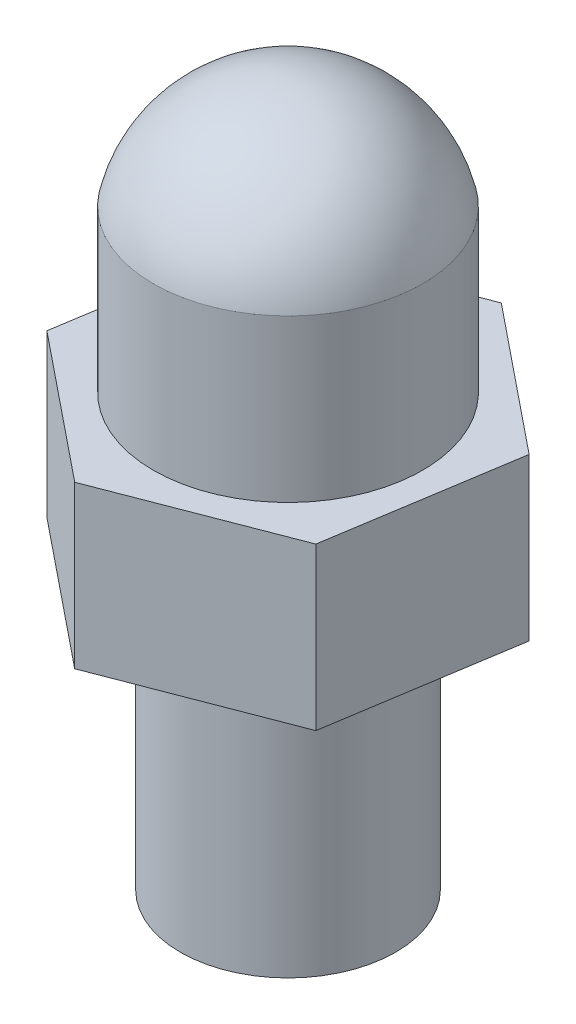
ISO-10303-21;
HEADER;
FILE_DESCRIPTION(('STEP AP214'),'2;1');
FILE_NAME('part.step','',(''),(''),'','','');
FILE_SCHEMA(('AUTOMOTIVE_DESIGN { 1 0 10303 214 1 1 1 1 }'));
ENDSEC;
DATA;
#1=APPLICATION_CONTEXT('core data for automotive mechanical design processes');
#2=APPLICATION_PROTOCOL_DEFINITION('international standard','automotive_design',2000,#1);
#3=PRODUCT_CONTEXT('',#1,'mechanical');
#4=PRODUCT('Part','Part','',(#3));
#5=PRODUCT_RELATED_PRODUCT_CATEGORY('part','',(#4));
#6=PRODUCT_DEFINITION_FORMATION('','',#4);
#7=PRODUCT_DEFINITION_CONTEXT('part definition',#1,'design');
#8=PRODUCT_DEFINITION('design','',#6,#7);
#9=PRODUCT_DEFINITION_SHAPE('','',#8);
#10=(LENGTH_UNIT() NAMED_UNIT(*) SI_UNIT(.MILLI.,.METRE.));
#11=(NAMED_UNIT(*) PLANE_ANGLE_UNIT() SI_UNIT($,.RADIAN.));
#12=(NAMED_UNIT(*) SI_UNIT($,.STERADIAN.) SOLID_ANGLE_UNIT());
#13=UNCERTAINTY_MEASURE_WITH_UNIT(LENGTH_MEASURE(1.E-05),#10,'distance_accuracy_value','');
#14=(GEOMETRIC_REPRESENTATION_CONTEXT(3) GLOBAL_UNCERTAINTY_ASSIGNED_CONTEXT((#13)) GLOBAL_UNIT_ASSIGNED_CONTEXT((#10,
#11,#12)) REPRESENTATION_CONTEXT('',''));
#15=CARTESIAN_POINT('',(0.,0.,0.));
#16=DIRECTION('',(0.,0.,1.));
#17=DIRECTION('',(1.,0.,0.));
#18=AXIS2_PLACEMENT_3D('',#15,#16,#17);
#19=CARTESIAN_POINT('',(0.,5.,0.));
#20=DIRECTION('',(0.,-1.,0.));
#21=DIRECTION('',(0.,0.,-1.));
#22=AXIS2_PLACEMENT_3D('',#19,#20,#21);
#23=CYLINDRICAL_SURFACE('',#22,2.);
#24=CARTESIAN_POINT('',(0.,5.,0.));
#25=DIRECTION('',(0.,1.,0.));
#26=DIRECTION('',(0.,0.,1.));
#27=AXIS2_PLACEMENT_3D('',#24,#25,#26);
#28=CIRCLE('',#27,2.);
#29=CARTESIAN_POINT('',(0.,5.,2.));
#30=VERTEX_POINT('',#29);
#31=EDGE_CURVE('E11',#30,#30,#28,.T.);
#32=ORIENTED_EDGE('',*,*,#31,.F.);
#33=EDGE_LOOP('',(#32));
#34=FACE_BOUND('',#33,.T.);
#35=CARTESIAN_POINT('',(0.,0.,0.));
#36=DIRECTION('',(0.,1.,0.));
#37=DIRECTION('',(0.,0.,1.));
#38=AXIS2_PLACEMENT_3D('',#35,#36,#37);
#39=CIRCLE('',#38,2.);
#40=CARTESIAN_POINT('',(0.,0.,2.));
#41=VERTEX_POINT('',#40);
#42=EDGE_CURVE('E42',#41,#41,#39,.T.);
#43=ORIENTED_EDGE('',*,*,#42,.T.);
#44=EDGE_LOOP('',(#43));
#45=FACE_BOUND('',#44,.T.);
#46=ADVANCED_FACE('F32',(#34,#45),#23,.T.);
#47=CARTESIAN_POINT('',(0.,0.,0.));
#48=DIRECTION('',(0.,1.,0.));
#49=DIRECTION('',(0.,0.,1.));
#50=AXIS2_PLACEMENT_3D('',#47,#48,#49);
#51=PLANE('',#50);
#52=ORIENTED_EDGE('',*,*,#42,.F.);
#53=EDGE_LOOP('',(#52));
#54=FACE_BOUND('',#53,.T.);
#55=ADVANCED_FACE('F142',(#54),#51,.F.);
#56=CARTESIAN_POINT('',(-0.538668538753638,8.,3.42196379369464));
#57=DIRECTION('',(-0.359250794673279,0.,-0.933241054887009));
#58=DIRECTION('',(-0.933241054887009,0.,0.359250794673279));
#59=AXIS2_PLACEMENT_3D('',#56,#57,#58);
#60=PLANE('',#59);
#61=DIRECTION('',(0.933241054887009,0.,-0.359250794673279));
#62=VECTOR('',#61,1.);
#63=CARTESIAN_POINT('',(-0.538668538753638,5.,3.42196379369464));
#64=LINE('',#63,#62);
#65=CARTESIAN_POINT('',(-0.538668538753638,5.,3.42196379369464));
#66=VERTEX_POINT('',#65);
#67=CARTESIAN_POINT('',(2.69417330679331,5.,2.17748253562741));
#68=VERTEX_POINT('',#67);
#69=EDGE_CURVE('E120',#66,#68,#64,.T.);
#70=ORIENTED_EDGE('',*,*,#69,.T.);
#71=DIRECTION('',(0.,-1.,0.));
#72=VECTOR('',#71,1.);
#73=CARTESIAN_POINT('',(2.69417330679331,8.,2.17748253562741));
#74=LINE('',#73,#72);
#75=CARTESIAN_POINT('',(2.69417330679331,8.,2.17748253562741));
#76=VERTEX_POINT('',#75);
#77=EDGE_CURVE('E137',#76,#68,#74,.T.);
#78=ORIENTED_EDGE('',*,*,#77,.F.);
#79=DIRECTION('',(0.933241054887009,0.,-0.359250794673279));
#80=VECTOR('',#79,1.);
#81=CARTESIAN_POINT('',(-0.538668538753638,8.,3.42196379369464));
#82=LINE('',#81,#80);
#83=CARTESIAN_POINT('',(-0.538668538753638,8.,3.42196379369464));
#84=VERTEX_POINT('',#83);
#85=EDGE_CURVE('E130',#84,#76,#82,.T.);
#86=ORIENTED_EDGE('',*,*,#85,.F.);
#87=DIRECTION('',(0.,-1.,0.));
#88=VECTOR('',#87,1.);
#89=CARTESIAN_POINT('',(-0.538668538753638,8.,3.42196379369464));
#90=LINE('',#89,#88);
#91=EDGE_CURVE('E116',#84,#66,#90,.T.);
#92=ORIENTED_EDGE('',*,*,#91,.T.);
#93=EDGE_LOOP('',(#70,#78,#86,#92));
#94=FACE_BOUND('',#93,.T.);
#95=ADVANCED_FACE('F144',(#94),#60,.F.);
#96=CARTESIAN_POINT('',(2.69417330679331,8.,2.17748253562741));
#97=DIRECTION('',(-0.987835858723377,0.,-0.155500212926698));
#98=DIRECTION('',(-0.155500212926698,0.,0.987835858723377));
#99=AXIS2_PLACEMENT_3D('',#96,#97,#98);
#100=PLANE('',#99);
#101=DIRECTION('',(0.155500212926698,0.,-0.987835858723377));
#102=VECTOR('',#101,1.);
#103=CARTESIAN_POINT('',(2.69417330679331,5.,2.17748253562741));
#104=LINE('',#103,#102);
#105=CARTESIAN_POINT('',(3.23284184554695,5.,-1.24448125806723));
#106=VERTEX_POINT('',#105);
#107=EDGE_CURVE('E123',#68,#106,#104,.T.);
#108=ORIENTED_EDGE('',*,*,#107,.T.);
#109=DIRECTION('',(0.,-1.,0.));
#110=VECTOR('',#109,1.);
#111=CARTESIAN_POINT('',(3.23284184554695,8.,-1.24448125806723));
#112=LINE('',#111,#110);
#113=CARTESIAN_POINT('',(3.23284184554695,8.,-1.24448125806723));
#114=VERTEX_POINT('',#113);
#115=EDGE_CURVE('E134',#114,#106,#112,.T.);
#116=ORIENTED_EDGE('',*,*,#115,.F.);
#117=DIRECTION('',(0.155500212926698,0.,-0.987835858723377));
#118=VECTOR('',#117,1.);
#119=CARTESIAN_POINT('',(2.69417330679331,8.,2.17748253562741));
#120=LINE('',#119,#118);
#121=EDGE_CURVE('E89',#76,#114,#120,.T.);
#122=ORIENTED_EDGE('',*,*,#121,.F.);
#123=ORIENTED_EDGE('',*,*,#77,.T.);
#124=EDGE_LOOP('',(#108,#116,#122,#123));
#125=FACE_BOUND('',#124,.T.);
#126=ADVANCED_FACE('F150',(#125),#100,.F.);
#127=CARTESIAN_POINT('',(3.23284184554695,8.,-1.24448125806723));
#128=DIRECTION('',(-0.628585064050098,0.,0.777740841960311));
#129=DIRECTION('',(0.777740841960312,0.,0.628585064050098));
#130=AXIS2_PLACEMENT_3D('',#127,#128,#129);
#131=PLANE('',#130);
#132=DIRECTION('',(-0.777740841960312,0.,-0.628585064050098));
#133=VECTOR('',#132,1.);
#134=CARTESIAN_POINT('',(3.23284184554695,5.,-1.24448125806723));
#135=LINE('',#134,#133);
#136=CARTESIAN_POINT('',(0.538668538753638,5.,-3.42196379369464));
#137=VERTEX_POINT('',#136);
#138=EDGE_CURVE('E125',#106,#137,#135,.T.);
#139=ORIENTED_EDGE('',*,*,#138,.T.);
#140=DIRECTION('',(0.,-1.,0.));
#141=VECTOR('',#140,1.);
#142=CARTESIAN_POINT('',(0.538668538753638,8.,-3.42196379369464));
#143=LINE('',#142,#141);
#144=CARTESIAN_POINT('',(0.538668538753638,8.,-3.42196379369464));
#145=VERTEX_POINT('',#144);
#146=EDGE_CURVE('E111',#145,#137,#143,.T.);
#147=ORIENTED_EDGE('',*,*,#146,.F.);
#148=DIRECTION('',(-0.777740841960312,0.,-0.628585064050098));
#149=VECTOR('',#148,1.);
#150=CARTESIAN_POINT('',(3.23284184554695,8.,-1.24448125806723));
#151=LINE('',#150,#149);
#152=EDGE_CURVE('E102',#114,#145,#151,.T.);
#153=ORIENTED_EDGE('',*,*,#152,.F.);
#154=ORIENTED_EDGE('',*,*,#115,.T.);
#155=EDGE_LOOP('',(#139,#147,#153,#154));
#156=FACE_BOUND('',#155,.T.);
#157=ADVANCED_FACE('F157',(#156),#131,.F.);
#158=CARTESIAN_POINT('',(0.538668538753638,8.,-3.42196379369464));
#159=DIRECTION('',(0.359250794673279,0.,0.933241054887009));
#160=DIRECTION('',(0.933241054887009,0.,-0.359250794673279));
#161=AXIS2_PLACEMENT_3D('',#158,#159,#160);
#162=PLANE('',#161);
#163=DIRECTION('',(-0.933241054887009,0.,0.359250794673279));
#164=VECTOR('',#163,1.);
#165=CARTESIAN_POINT('',(0.538668538753638,5.,-3.42196379369464));
#166=LINE('',#165,#164);
#167=CARTESIAN_POINT('',(-2.69417330679331,5.,-2.17748253562741));
#168=VERTEX_POINT('',#167);
#169=EDGE_CURVE('E110',#137,#168,#166,.T.);
#170=ORIENTED_EDGE('',*,*,#169,.T.);
#171=DIRECTION('',(0.,-1.,0.));
#172=VECTOR('',#171,1.);
#173=CARTESIAN_POINT('',(-2.69417330679331,8.,-2.17748253562741));
#174=LINE('',#173,#172);
#175=CARTESIAN_POINT('',(-2.69417330679331,8.,-2.17748253562741));
#176=VERTEX_POINT('',#175);
#177=EDGE_CURVE('E107',#176,#168,#174,.T.);
#178=ORIENTED_EDGE('',*,*,#177,.F.);
#179=DIRECTION('',(-0.933241054887009,0.,0.359250794673279));
#180=VECTOR('',#179,1.);
#181=CARTESIAN_POINT('',(0.538668538753638,8.,-3.42196379369464));
#182=LINE('',#181,#180);
#183=EDGE_CURVE('E96',#145,#176,#182,.T.);
#184=ORIENTED_EDGE('',*,*,#183,.F.);
#185=ORIENTED_EDGE('',*,*,#146,.T.);
#186=EDGE_LOOP('',(#170,#178,#184,#185));
#187=FACE_BOUND('',#186,.T.);
#188=ADVANCED_FACE('F108',(#187),#162,.F.);
#189=CARTESIAN_POINT('',(-2.69417330679331,8.,-2.17748253562741));
#190=DIRECTION('',(0.987835858723377,0.,0.155500212926698));
#191=DIRECTION('',(0.155500212926698,0.,-0.987835858723377));
#192=AXIS2_PLACEMENT_3D('',#189,#190,#191);
#193=PLANE('',#192);
#194=DIRECTION('',(-0.155500212926698,0.,0.987835858723377));
#195=VECTOR('',#194,1.);
#196=CARTESIAN_POINT('',(-2.69417330679331,5.,-2.17748253562741));
#197=LINE('',#196,#195);
#198=CARTESIAN_POINT('',(-3.23284184554695,5.,1.24448125806723));
#199=VERTEX_POINT('',#198);
#200=EDGE_CURVE('E74',#168,#199,#197,.T.);
#201=ORIENTED_EDGE('',*,*,#200,.T.);
#202=DIRECTION('',(0.,-1.,0.));
#203=VECTOR('',#202,1.);
#204=CARTESIAN_POINT('',(-3.23284184554695,8.,1.24448125806723));
#205=LINE('',#204,#203);
#206=CARTESIAN_POINT('',(-3.23284184554695,8.,1.24448125806723));
#207=VERTEX_POINT('',#206);
#208=EDGE_CURVE('E112',#207,#199,#205,.T.);
#209=ORIENTED_EDGE('',*,*,#208,.F.);
#210=DIRECTION('',(-0.155500212926698,0.,0.987835858723377));
#211=VECTOR('',#210,1.);
#212=CARTESIAN_POINT('',(-2.69417330679331,8.,-2.17748253562741));
#213=LINE('',#212,#211);
#214=EDGE_CURVE('E100',#176,#207,#213,.T.);
#215=ORIENTED_EDGE('',*,*,#214,.F.);
#216=ORIENTED_EDGE('',*,*,#177,.T.);
#217=EDGE_LOOP('',(#201,#209,#215,#216));
#218=FACE_BOUND('',#217,.T.);
#219=ADVANCED_FACE('F114',(#218),#193,.F.);
#220=CARTESIAN_POINT('',(-3.23284184554695,8.,1.24448125806723));
#221=DIRECTION('',(0.628585064050098,0.,-0.777740841960311));
#222=DIRECTION('',(-0.777740841960312,0.,-0.628585064050098));
#223=AXIS2_PLACEMENT_3D('',#220,#221,#222);
#224=PLANE('',#223);
#225=DIRECTION('',(0.777740841960311,0.,0.628585064050098));
#226=VECTOR('',#225,1.);
#227=CARTESIAN_POINT('',(-3.23284184554695,5.,1.24448125806723));
#228=LINE('',#227,#226);
#229=EDGE_CURVE('E80',#199,#66,#228,.T.);
#230=ORIENTED_EDGE('',*,*,#229,.T.);
#231=ORIENTED_EDGE('',*,*,#91,.F.);
#232=DIRECTION('',(0.777740841960311,0.,0.628585064050098));
#233=VECTOR('',#232,1.);
#234=CARTESIAN_POINT('',(-3.23284184554695,8.,1.24448125806723));
#235=LINE('',#234,#233);
#236=EDGE_CURVE('E51',#207,#84,#235,.T.);
#237=ORIENTED_EDGE('',*,*,#236,.F.);
#238=ORIENTED_EDGE('',*,*,#208,.T.);
#239=EDGE_LOOP('',(#230,#231,#237,#238));
#240=FACE_BOUND('',#239,.T.);
#241=ADVANCED_FACE('F165',(#240),#224,.F.);
#242=CARTESIAN_POINT('',(0.,8.,0.));
#243=DIRECTION('',(0.,1.,0.));
#244=DIRECTION('',(0.,0.,1.));
#245=AXIS2_PLACEMENT_3D('',#242,#243,#244);
#246=PLANE('',#245);
#247=CARTESIAN_POINT('',(0.,8.,0.));
#248=DIRECTION('',(0.,1.,0.));
#249=DIRECTION('',(0.,0.,1.));
#250=AXIS2_PLACEMENT_3D('',#247,#248,#249);
#251=CIRCLE('',#250,2.5);
#252=CARTESIAN_POINT('',(0.,8.,2.5));
#253=VERTEX_POINT('',#252);
#254=EDGE_CURVE('E187',#253,#253,#251,.T.);
#255=ORIENTED_EDGE('',*,*,#254,.F.);
#256=EDGE_LOOP('',(#255));
#257=FACE_BOUND('',#256,.T.);
#258=ORIENTED_EDGE('',*,*,#85,.T.);
#259=ORIENTED_EDGE('',*,*,#121,.T.);
#260=ORIENTED_EDGE('',*,*,#152,.T.);
#261=ORIENTED_EDGE('',*,*,#183,.T.);
#262=ORIENTED_EDGE('',*,*,#214,.T.);
#263=ORIENTED_EDGE('',*,*,#236,.T.);
#264=EDGE_LOOP('',(#258,#259,#260,#261,#262,#263));
#265=FACE_BOUND('',#264,.T.);
#266=ADVANCED_FACE('F98',(#257,#265),#246,.T.);
#267=CARTESIAN_POINT('',(0.,5.,0.));
#268=DIRECTION('',(0.,1.,0.));
#269=DIRECTION('',(0.,0.,1.));
#270=AXIS2_PLACEMENT_3D('',#267,#268,#269);
#271=PLANE('',#270);
#272=ORIENTED_EDGE('',*,*,#31,.T.);
#273=EDGE_LOOP('',(#272));
#274=FACE_BOUND('',#273,.T.);
#275=ORIENTED_EDGE('',*,*,#69,.F.);
#276=ORIENTED_EDGE('',*,*,#229,.F.);
#277=ORIENTED_EDGE('',*,*,#200,.F.);
#278=ORIENTED_EDGE('',*,*,#169,.F.);
#279=ORIENTED_EDGE('',*,*,#138,.F.);
#280=ORIENTED_EDGE('',*,*,#107,.F.);
#281=EDGE_LOOP('',(#275,#276,#277,#278,#279,#280));
#282=FACE_BOUND('',#281,.T.);
#283=ADVANCED_FACE('F168',(#274,#282),#271,.F.);
#284=CARTESIAN_POINT('',(0.,11.,0.));
#285=DIRECTION('',(0.,-1.,0.));
#286=DIRECTION('',(0.,0.,-1.));
#287=AXIS2_PLACEMENT_3D('',#284,#285,#286);
#288=CYLINDRICAL_SURFACE('',#287,2.5);
#289=CARTESIAN_POINT('',(0.,11.,0.));
#290=DIRECTION('',(0.,1.,0.));
#291=DIRECTION('',(0.,0.,1.));
#292=AXIS2_PLACEMENT_3D('',#289,#290,#291);
#293=CIRCLE('',#292,2.5);
#294=CARTESIAN_POINT('',(0.,11.,2.5));
#295=VERTEX_POINT('',#294);
#296=EDGE_CURVE('E36',#295,#295,#293,.T.);
#297=ORIENTED_EDGE('',*,*,#296,.F.);
#298=EDGE_LOOP('',(#297));
#299=FACE_BOUND('',#298,.T.);
#300=ORIENTED_EDGE('',*,*,#254,.T.);
#301=EDGE_LOOP('',(#300));
#302=FACE_BOUND('',#301,.T.);
#303=ADVANCED_FACE('F171',(#299,#302),#288,.T.);
#304=CARTESIAN_POINT('',(0.,10.4375,0.));
#305=DIRECTION('',(0.,0.,1.));
#306=DIRECTION('',(1.,0.,0.));
#307=AXIS2_PLACEMENT_3D('',#304,#305,#306);
#308=SPHERICAL_SURFACE('',#307,2.5625);
#309=CARTESIAN_POINT('',(0.,10.4375,0.));
#310=DIRECTION('',(0.,1.,0.));
#311=DIRECTION('',(0.,0.,1.));
#312=AXIS2_PLACEMENT_3D('',#309,#310,#311);
#313=SPHERICAL_SURFACE('',#312,2.5625);
#314=ORIENTED_EDGE('',*,*,#296,.T.);
#315=EDGE_LOOP('',(#314));
#316=FACE_BOUND('',#315,.T.);
#317=ADVANCED_FACE('F34',(#316),#313,.T.);
#318=CLOSED_SHELL('',(#46,#55,#95,#126,#157,#188,#219,#241,#266,#283,#303,#317));
#319=MANIFOLD_SOLID_BREP('B2',#318);
#320=ADVANCED_BREP_SHAPE_REPRESENTATION('',(#18,#319),#14);
#321=SHAPE_DEFINITION_REPRESENTATION(#9,#320);
ENDSEC;
END-ISO-10303-21;
